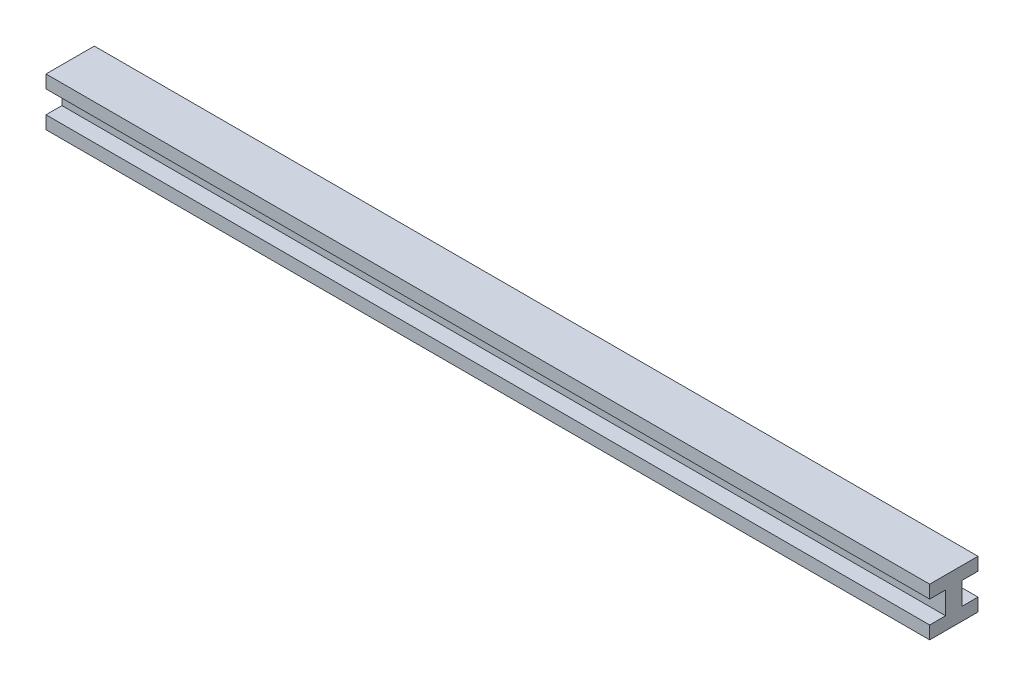
ISO-10303-21;
HEADER;
FILE_DESCRIPTION(('STEP AP214'),'2;1');
FILE_NAME('part.step','',(''),(''),'','','');
FILE_SCHEMA(('AUTOMOTIVE_DESIGN { 1 0 10303 214 1 1 1 1 }'));
ENDSEC;
DATA;
#1=APPLICATION_CONTEXT('core data for automotive mechanical design processes');
#2=APPLICATION_PROTOCOL_DEFINITION('international standard','automotive_design',2000,#1);
#3=PRODUCT_CONTEXT('',#1,'mechanical');
#4=PRODUCT('Part','Part','',(#3));
#5=PRODUCT_RELATED_PRODUCT_CATEGORY('part','',(#4));
#6=PRODUCT_DEFINITION_FORMATION('','',#4);
#7=PRODUCT_DEFINITION_CONTEXT('part definition',#1,'design');
#8=PRODUCT_DEFINITION('design','',#6,#7);
#9=PRODUCT_DEFINITION_SHAPE('','',#8);
#10=(LENGTH_UNIT() NAMED_UNIT(*) SI_UNIT(.MILLI.,.METRE.));
#11=(NAMED_UNIT(*) PLANE_ANGLE_UNIT() SI_UNIT($,.RADIAN.));
#12=(NAMED_UNIT(*) SI_UNIT($,.STERADIAN.) SOLID_ANGLE_UNIT());
#13=UNCERTAINTY_MEASURE_WITH_UNIT(LENGTH_MEASURE(1.E-05),#10,'distance_accuracy_value','');
#14=(GEOMETRIC_REPRESENTATION_CONTEXT(3) GLOBAL_UNCERTAINTY_ASSIGNED_CONTEXT((#13)) GLOBAL_UNIT_ASSIGNED_CONTEXT((#10,
#11,#12)) REPRESENTATION_CONTEXT('',''));
#15=CARTESIAN_POINT('',(0.,0.,0.));
#16=DIRECTION('',(0.,0.,1.));
#17=DIRECTION('',(1.,0.,0.));
#18=AXIS2_PLACEMENT_3D('',#15,#16,#17);
#19=CARTESIAN_POINT('',(1500.,0.,0.));
#20=DIRECTION('',(0.,0.,-1.));
#21=DIRECTION('',(-1.,0.,0.));
#22=AXIS2_PLACEMENT_3D('',#19,#20,#21);
#23=PLANE('',#22);
#24=DIRECTION('',(0.,-1.,0.));
#25=VECTOR('',#24,1.);
#26=CARTESIAN_POINT('',(0.,0.,0.));
#27=LINE('',#26,#25);
#28=CARTESIAN_POINT('',(0.,0.,0.));
#29=VERTEX_POINT('',#28);
#30=CARTESIAN_POINT('',(0.,-22.,0.));
#31=VERTEX_POINT('',#30);
#32=EDGE_CURVE('E157',#29,#31,#27,.T.);
#33=ORIENTED_EDGE('',*,*,#32,.T.);
#34=DIRECTION('',(-1.,0.,0.));
#35=VECTOR('',#34,1.);
#36=CARTESIAN_POINT('',(1500.,-22.,0.));
#37=LINE('',#36,#35);
#38=CARTESIAN_POINT('',(1500.,-22.,0.));
#39=VERTEX_POINT('',#38);
#40=EDGE_CURVE('E11',#39,#31,#37,.T.);
#41=ORIENTED_EDGE('',*,*,#40,.F.);
#42=DIRECTION('',(0.,-1.,0.));
#43=VECTOR('',#42,1.);
#44=CARTESIAN_POINT('',(1500.,0.,0.));
#45=LINE('',#44,#43);
#46=CARTESIAN_POINT('',(1500.,0.,0.));
#47=VERTEX_POINT('',#46);
#48=EDGE_CURVE('E186',#47,#39,#45,.T.);
#49=ORIENTED_EDGE('',*,*,#48,.F.);
#50=DIRECTION('',(-1.,0.,0.));
#51=VECTOR('',#50,1.);
#52=CARTESIAN_POINT('',(1500.,0.,0.));
#53=LINE('',#52,#51);
#54=EDGE_CURVE('E53',#47,#29,#53,.T.);
#55=ORIENTED_EDGE('',*,*,#54,.T.);
#56=EDGE_LOOP('',(#33,#41,#49,#55));
#57=FACE_BOUND('',#56,.T.);
#58=ADVANCED_FACE('F37',(#57),#23,.F.);
#59=CARTESIAN_POINT('',(1500.,-22.,0.));
#60=DIRECTION('',(0.,1.,0.));
#61=DIRECTION('',(0.,0.,1.));
#62=AXIS2_PLACEMENT_3D('',#59,#60,#61);
#63=PLANE('',#62);
#64=DIRECTION('',(0.,0.,-1.));
#65=VECTOR('',#64,1.);
#66=CARTESIAN_POINT('',(0.,-22.,0.));
#67=LINE('',#66,#65);
#68=CARTESIAN_POINT('',(0.,-22.,-27.));
#69=VERTEX_POINT('',#68);
#70=EDGE_CURVE('E159',#31,#69,#67,.T.);
#71=ORIENTED_EDGE('',*,*,#70,.T.);
#72=DIRECTION('',(-1.,0.,0.));
#73=VECTOR('',#72,1.);
#74=CARTESIAN_POINT('',(1500.,-22.,-27.));
#75=LINE('',#74,#73);
#76=CARTESIAN_POINT('',(1500.,-22.,-27.));
#77=VERTEX_POINT('',#76);
#78=EDGE_CURVE('E45',#77,#69,#75,.T.);
#79=ORIENTED_EDGE('',*,*,#78,.F.);
#80=DIRECTION('',(0.,0.,-1.));
#81=VECTOR('',#80,1.);
#82=CARTESIAN_POINT('',(1500.,-22.,0.));
#83=LINE('',#82,#81);
#84=EDGE_CURVE('E103',#39,#77,#83,.T.);
#85=ORIENTED_EDGE('',*,*,#84,.F.);
#86=ORIENTED_EDGE('',*,*,#40,.T.);
#87=EDGE_LOOP('',(#71,#79,#85,#86));
#88=FACE_BOUND('',#87,.T.);
#89=ADVANCED_FACE('F252',(#88),#63,.F.);
#90=CARTESIAN_POINT('',(1500.,-22.,-27.));
#91=DIRECTION('',(0.,0.,-1.));
#92=DIRECTION('',(0.,1.,0.));
#93=AXIS2_PLACEMENT_3D('',#90,#91,#92);
#94=PLANE('',#93);
#95=DIRECTION('',(0.,-1.,0.));
#96=VECTOR('',#95,1.);
#97=CARTESIAN_POINT('',(0.,-22.,-27.));
#98=LINE('',#97,#96);
#99=CARTESIAN_POINT('',(0.,-60.,-27.));
#100=VERTEX_POINT('',#99);
#101=EDGE_CURVE('E161',#69,#100,#98,.T.);
#102=ORIENTED_EDGE('',*,*,#101,.T.);
#103=DIRECTION('',(-1.,0.,0.));
#104=VECTOR('',#103,1.);
#105=CARTESIAN_POINT('',(1500.,-60.,-27.));
#106=LINE('',#105,#104);
#107=CARTESIAN_POINT('',(1500.,-60.,-27.));
#108=VERTEX_POINT('',#107);
#109=EDGE_CURVE('E201',#108,#100,#106,.T.);
#110=ORIENTED_EDGE('',*,*,#109,.F.);
#111=DIRECTION('',(0.,-1.,0.));
#112=VECTOR('',#111,1.);
#113=CARTESIAN_POINT('',(1500.,-22.,-27.));
#114=LINE('',#113,#112);
#115=EDGE_CURVE('E209',#77,#108,#114,.T.);
#116=ORIENTED_EDGE('',*,*,#115,.F.);
#117=ORIENTED_EDGE('',*,*,#78,.T.);
#118=EDGE_LOOP('',(#102,#110,#116,#117));
#119=FACE_BOUND('',#118,.T.);
#120=ADVANCED_FACE('F207',(#119),#94,.F.);
#121=CARTESIAN_POINT('',(1500.,-60.,-27.));
#122=DIRECTION('',(0.,-1.,0.));
#123=DIRECTION('',(0.,0.,-1.));
#124=AXIS2_PLACEMENT_3D('',#121,#122,#123);
#125=PLANE('',#124);
#126=DIRECTION('',(0.,0.,1.));
#127=VECTOR('',#126,1.);
#128=CARTESIAN_POINT('',(0.,-60.,-27.));
#129=LINE('',#128,#127);
#130=CARTESIAN_POINT('',(0.,-60.,0.));
#131=VERTEX_POINT('',#130);
#132=EDGE_CURVE('E163',#100,#131,#129,.T.);
#133=ORIENTED_EDGE('',*,*,#132,.T.);
#134=DIRECTION('',(-1.,0.,0.));
#135=VECTOR('',#134,1.);
#136=CARTESIAN_POINT('',(1500.,-60.,0.));
#137=LINE('',#136,#135);
#138=CARTESIAN_POINT('',(1500.,-60.,0.));
#139=VERTEX_POINT('',#138);
#140=EDGE_CURVE('E198',#139,#131,#137,.T.);
#141=ORIENTED_EDGE('',*,*,#140,.F.);
#142=DIRECTION('',(0.,0.,1.));
#143=VECTOR('',#142,1.);
#144=CARTESIAN_POINT('',(1500.,-60.,-27.));
#145=LINE('',#144,#143);
#146=EDGE_CURVE('E226',#108,#139,#145,.T.);
#147=ORIENTED_EDGE('',*,*,#146,.F.);
#148=ORIENTED_EDGE('',*,*,#109,.T.);
#149=EDGE_LOOP('',(#133,#141,#147,#148));
#150=FACE_BOUND('',#149,.T.);
#151=ADVANCED_FACE('F216',(#150),#125,.F.);
#152=CARTESIAN_POINT('',(1500.,-60.,0.));
#153=DIRECTION('',(0.,0.,-1.));
#154=DIRECTION('',(0.,1.,0.));
#155=AXIS2_PLACEMENT_3D('',#152,#153,#154);
#156=PLANE('',#155);
#157=DIRECTION('',(0.,-1.,0.));
#158=VECTOR('',#157,1.);
#159=CARTESIAN_POINT('',(0.,-60.,0.));
#160=LINE('',#159,#158);
#161=CARTESIAN_POINT('',(0.,-82.,0.));
#162=VERTEX_POINT('',#161);
#163=EDGE_CURVE('E165',#131,#162,#160,.T.);
#164=ORIENTED_EDGE('',*,*,#163,.T.);
#165=DIRECTION('',(-1.,0.,0.));
#166=VECTOR('',#165,1.);
#167=CARTESIAN_POINT('',(1500.,-82.,0.));
#168=LINE('',#167,#166);
#169=CARTESIAN_POINT('',(1500.,-82.,0.));
#170=VERTEX_POINT('',#169);
#171=EDGE_CURVE('E196',#170,#162,#168,.T.);
#172=ORIENTED_EDGE('',*,*,#171,.F.);
#173=DIRECTION('',(0.,-1.,0.));
#174=VECTOR('',#173,1.);
#175=CARTESIAN_POINT('',(1500.,-60.,0.));
#176=LINE('',#175,#174);
#177=EDGE_CURVE('E222',#139,#170,#176,.T.);
#178=ORIENTED_EDGE('',*,*,#177,.F.);
#179=ORIENTED_EDGE('',*,*,#140,.T.);
#180=EDGE_LOOP('',(#164,#172,#178,#179));
#181=FACE_BOUND('',#180,.T.);
#182=ADVANCED_FACE('F220',(#181),#156,.F.);
#183=CARTESIAN_POINT('',(1500.,-82.,-82.));
#184=DIRECTION('',(0.,-1.,0.));
#185=DIRECTION('',(0.,0.,-1.));
#186=AXIS2_PLACEMENT_3D('',#183,#184,#185);
#187=PLANE('',#186);
#188=DIRECTION('',(0.,0.,1.));
#189=VECTOR('',#188,1.);
#190=CARTESIAN_POINT('',(0.,-82.,-82.));
#191=LINE('',#190,#189);
#192=CARTESIAN_POINT('',(0.,-82.,-82.));
#193=VERTEX_POINT('',#192);
#194=EDGE_CURVE('E168',#193,#162,#191,.T.);
#195=ORIENTED_EDGE('',*,*,#194,.F.);
#196=DIRECTION('',(-1.,0.,0.));
#197=VECTOR('',#196,1.);
#198=CARTESIAN_POINT('',(1500.,-82.,-82.));
#199=LINE('',#198,#197);
#200=CARTESIAN_POINT('',(1500.,-82.,-82.));
#201=VERTEX_POINT('',#200);
#202=EDGE_CURVE('E194',#201,#193,#199,.T.);
#203=ORIENTED_EDGE('',*,*,#202,.F.);
#204=DIRECTION('',(0.,0.,1.));
#205=VECTOR('',#204,1.);
#206=CARTESIAN_POINT('',(1500.,-82.,-82.));
#207=LINE('',#206,#205);
#208=EDGE_CURVE('E225',#201,#170,#207,.T.);
#209=ORIENTED_EDGE('',*,*,#208,.T.);
#210=ORIENTED_EDGE('',*,*,#171,.T.);
#211=EDGE_LOOP('',(#195,#203,#209,#210));
#212=FACE_BOUND('',#211,.T.);
#213=ADVANCED_FACE('F268',(#212),#187,.T.);
#214=CARTESIAN_POINT('',(1500.,-60.,-82.));
#215=DIRECTION('',(0.,0.,-1.));
#216=DIRECTION('',(-1.,0.,0.));
#217=AXIS2_PLACEMENT_3D('',#214,#215,#216);
#218=PLANE('',#217);
#219=DIRECTION('',(0.,-1.,0.));
#220=VECTOR('',#219,1.);
#221=CARTESIAN_POINT('',(0.,-60.,-82.));
#222=LINE('',#221,#220);
#223=CARTESIAN_POINT('',(0.,-60.,-82.));
#224=VERTEX_POINT('',#223);
#225=EDGE_CURVE('E171',#224,#193,#222,.T.);
#226=ORIENTED_EDGE('',*,*,#225,.F.);
#227=DIRECTION('',(-1.,0.,0.));
#228=VECTOR('',#227,1.);
#229=CARTESIAN_POINT('',(1500.,-60.,-82.));
#230=LINE('',#229,#228);
#231=CARTESIAN_POINT('',(1500.,-60.,-82.));
#232=VERTEX_POINT('',#231);
#233=EDGE_CURVE('E192',#232,#224,#230,.T.);
#234=ORIENTED_EDGE('',*,*,#233,.F.);
#235=DIRECTION('',(0.,-1.,0.));
#236=VECTOR('',#235,1.);
#237=CARTESIAN_POINT('',(1500.,-60.,-82.));
#238=LINE('',#237,#236);
#239=EDGE_CURVE('E228',#232,#201,#238,.T.);
#240=ORIENTED_EDGE('',*,*,#239,.T.);
#241=ORIENTED_EDGE('',*,*,#202,.T.);
#242=EDGE_LOOP('',(#226,#234,#240,#241));
#243=FACE_BOUND('',#242,.T.);
#244=ADVANCED_FACE('F271',(#243),#218,.T.);
#245=CARTESIAN_POINT('',(1500.,-60.,-82.));
#246=DIRECTION('',(0.,-1.,0.));
#247=DIRECTION('',(0.,0.,-1.));
#248=AXIS2_PLACEMENT_3D('',#245,#246,#247);
#249=PLANE('',#248);
#250=DIRECTION('',(0.,0.,1.));
#251=VECTOR('',#250,1.);
#252=CARTESIAN_POINT('',(0.,-60.,-82.));
#253=LINE('',#252,#251);
#254=CARTESIAN_POINT('',(0.,-60.,-55.));
#255=VERTEX_POINT('',#254);
#256=EDGE_CURVE('E174',#224,#255,#253,.T.);
#257=ORIENTED_EDGE('',*,*,#256,.T.);
#258=DIRECTION('',(-1.,0.,0.));
#259=VECTOR('',#258,1.);
#260=CARTESIAN_POINT('',(1500.,-60.,-55.));
#261=LINE('',#260,#259);
#262=CARTESIAN_POINT('',(1500.,-60.,-55.));
#263=VERTEX_POINT('',#262);
#264=EDGE_CURVE('E190',#263,#255,#261,.T.);
#265=ORIENTED_EDGE('',*,*,#264,.F.);
#266=DIRECTION('',(0.,0.,1.));
#267=VECTOR('',#266,1.);
#268=CARTESIAN_POINT('',(1500.,-60.,-82.));
#269=LINE('',#268,#267);
#270=EDGE_CURVE('E235',#232,#263,#269,.T.);
#271=ORIENTED_EDGE('',*,*,#270,.F.);
#272=ORIENTED_EDGE('',*,*,#233,.T.);
#273=EDGE_LOOP('',(#257,#265,#271,#272));
#274=FACE_BOUND('',#273,.T.);
#275=ADVANCED_FACE('F275',(#274),#249,.F.);
#276=CARTESIAN_POINT('',(1500.,-22.,-55.));
#277=DIRECTION('',(0.,0.,-1.));
#278=DIRECTION('',(-1.,0.,0.));
#279=AXIS2_PLACEMENT_3D('',#276,#277,#278);
#280=PLANE('',#279);
#281=DIRECTION('',(0.,-1.,0.));
#282=VECTOR('',#281,1.);
#283=CARTESIAN_POINT('',(0.,-22.,-55.));
#284=LINE('',#283,#282);
#285=CARTESIAN_POINT('',(0.,-22.,-55.));
#286=VERTEX_POINT('',#285);
#287=EDGE_CURVE('E177',#286,#255,#284,.T.);
#288=ORIENTED_EDGE('',*,*,#287,.F.);
#289=DIRECTION('',(-1.,0.,0.));
#290=VECTOR('',#289,1.);
#291=CARTESIAN_POINT('',(1500.,-22.,-55.));
#292=LINE('',#291,#290);
#293=CARTESIAN_POINT('',(1500.,-22.,-55.));
#294=VERTEX_POINT('',#293);
#295=EDGE_CURVE('E149',#294,#286,#292,.T.);
#296=ORIENTED_EDGE('',*,*,#295,.F.);
#297=DIRECTION('',(0.,-1.,0.));
#298=VECTOR('',#297,1.);
#299=CARTESIAN_POINT('',(1500.,-22.,-55.));
#300=LINE('',#299,#298);
#301=EDGE_CURVE('E139',#294,#263,#300,.T.);
#302=ORIENTED_EDGE('',*,*,#301,.T.);
#303=ORIENTED_EDGE('',*,*,#264,.T.);
#304=EDGE_LOOP('',(#288,#296,#302,#303));
#305=FACE_BOUND('',#304,.T.);
#306=ADVANCED_FACE('F238',(#305),#280,.T.);
#307=CARTESIAN_POINT('',(1500.,-22.,-55.));
#308=DIRECTION('',(0.,1.,0.));
#309=DIRECTION('',(0.,0.,1.));
#310=AXIS2_PLACEMENT_3D('',#307,#308,#309);
#311=PLANE('',#310);
#312=DIRECTION('',(0.,0.,-1.));
#313=VECTOR('',#312,1.);
#314=CARTESIAN_POINT('',(0.,-22.,-55.));
#315=LINE('',#314,#313);
#316=CARTESIAN_POINT('',(0.,-22.,-82.));
#317=VERTEX_POINT('',#316);
#318=EDGE_CURVE('E146',#286,#317,#315,.T.);
#319=ORIENTED_EDGE('',*,*,#318,.T.);
#320=DIRECTION('',(-1.,0.,0.));
#321=VECTOR('',#320,1.);
#322=CARTESIAN_POINT('',(1500.,-22.,-82.));
#323=LINE('',#322,#321);
#324=CARTESIAN_POINT('',(1500.,-22.,-82.));
#325=VERTEX_POINT('',#324);
#326=EDGE_CURVE('E143',#325,#317,#323,.T.);
#327=ORIENTED_EDGE('',*,*,#326,.F.);
#328=DIRECTION('',(0.,0.,-1.));
#329=VECTOR('',#328,1.);
#330=CARTESIAN_POINT('',(1500.,-22.,-55.));
#331=LINE('',#330,#329);
#332=EDGE_CURVE('E132',#294,#325,#331,.T.);
#333=ORIENTED_EDGE('',*,*,#332,.F.);
#334=ORIENTED_EDGE('',*,*,#295,.T.);
#335=EDGE_LOOP('',(#319,#327,#333,#334));
#336=FACE_BOUND('',#335,.T.);
#337=ADVANCED_FACE('F144',(#336),#311,.F.);
#338=CARTESIAN_POINT('',(1500.,0.,-82.));
#339=DIRECTION('',(0.,0.,-1.));
#340=DIRECTION('',(-1.,0.,0.));
#341=AXIS2_PLACEMENT_3D('',#338,#339,#340);
#342=PLANE('',#341);
#343=DIRECTION('',(0.,-1.,0.));
#344=VECTOR('',#343,1.);
#345=CARTESIAN_POINT('',(0.,0.,-82.));
#346=LINE('',#345,#344);
#347=CARTESIAN_POINT('',(0.,0.,-82.));
#348=VERTEX_POINT('',#347);
#349=EDGE_CURVE('E181',#348,#317,#346,.T.);
#350=ORIENTED_EDGE('',*,*,#349,.F.);
#351=DIRECTION('',(-1.,0.,0.));
#352=VECTOR('',#351,1.);
#353=CARTESIAN_POINT('',(1500.,0.,-82.));
#354=LINE('',#353,#352);
#355=CARTESIAN_POINT('',(1500.,0.,-82.));
#356=VERTEX_POINT('',#355);
#357=EDGE_CURVE('E91',#356,#348,#354,.T.);
#358=ORIENTED_EDGE('',*,*,#357,.F.);
#359=DIRECTION('',(0.,-1.,0.));
#360=VECTOR('',#359,1.);
#361=CARTESIAN_POINT('',(1500.,0.,-82.));
#362=LINE('',#361,#360);
#363=EDGE_CURVE('E137',#356,#325,#362,.T.);
#364=ORIENTED_EDGE('',*,*,#363,.T.);
#365=ORIENTED_EDGE('',*,*,#326,.T.);
#366=EDGE_LOOP('',(#350,#358,#364,#365));
#367=FACE_BOUND('',#366,.T.);
#368=ADVANCED_FACE('F151',(#367),#342,.T.);
#369=CARTESIAN_POINT('',(1500.,0.,0.));
#370=DIRECTION('',(0.,1.,0.));
#371=DIRECTION('',(0.,0.,1.));
#372=AXIS2_PLACEMENT_3D('',#369,#370,#371);
#373=PLANE('',#372);
#374=DIRECTION('',(0.,0.,-1.));
#375=VECTOR('',#374,1.);
#376=CARTESIAN_POINT('',(0.,0.,0.));
#377=LINE('',#376,#375);
#378=EDGE_CURVE('E183',#29,#348,#377,.T.);
#379=ORIENTED_EDGE('',*,*,#378,.F.);
#380=ORIENTED_EDGE('',*,*,#54,.F.);
#381=DIRECTION('',(0.,0.,-1.));
#382=VECTOR('',#381,1.);
#383=CARTESIAN_POINT('',(1500.,0.,0.));
#384=LINE('',#383,#382);
#385=EDGE_CURVE('E152',#47,#356,#384,.T.);
#386=ORIENTED_EDGE('',*,*,#385,.T.);
#387=ORIENTED_EDGE('',*,*,#357,.T.);
#388=EDGE_LOOP('',(#379,#380,#386,#387));
#389=FACE_BOUND('',#388,.T.);
#390=ADVANCED_FACE('F241',(#389),#373,.T.);
#391=CARTESIAN_POINT('',(1500.,0.,0.));
#392=DIRECTION('',(1.,0.,0.));
#393=DIRECTION('',(0.,0.,-1.));
#394=AXIS2_PLACEMENT_3D('',#391,#392,#393);
#395=PLANE('',#394);
#396=ORIENTED_EDGE('',*,*,#48,.T.);
#397=ORIENTED_EDGE('',*,*,#84,.T.);
#398=ORIENTED_EDGE('',*,*,#115,.T.);
#399=ORIENTED_EDGE('',*,*,#146,.T.);
#400=ORIENTED_EDGE('',*,*,#177,.T.);
#401=ORIENTED_EDGE('',*,*,#208,.F.);
#402=ORIENTED_EDGE('',*,*,#239,.F.);
#403=ORIENTED_EDGE('',*,*,#270,.T.);
#404=ORIENTED_EDGE('',*,*,#301,.F.);
#405=ORIENTED_EDGE('',*,*,#332,.T.);
#406=ORIENTED_EDGE('',*,*,#363,.F.);
#407=ORIENTED_EDGE('',*,*,#385,.F.);
#408=EDGE_LOOP('',(#396,#397,#398,#399,#400,#401,#402,#403,#404,#405,#406,#407));
#409=FACE_BOUND('',#408,.T.);
#410=ADVANCED_FACE('F134',(#409),#395,.T.);
#411=CARTESIAN_POINT('',(0.,0.,0.));
#412=DIRECTION('',(1.,0.,0.));
#413=DIRECTION('',(0.,0.,-1.));
#414=AXIS2_PLACEMENT_3D('',#411,#412,#413);
#415=PLANE('',#414);
#416=ORIENTED_EDGE('',*,*,#32,.F.);
#417=ORIENTED_EDGE('',*,*,#378,.T.);
#418=ORIENTED_EDGE('',*,*,#349,.T.);
#419=ORIENTED_EDGE('',*,*,#318,.F.);
#420=ORIENTED_EDGE('',*,*,#287,.T.);
#421=ORIENTED_EDGE('',*,*,#256,.F.);
#422=ORIENTED_EDGE('',*,*,#225,.T.);
#423=ORIENTED_EDGE('',*,*,#194,.T.);
#424=ORIENTED_EDGE('',*,*,#163,.F.);
#425=ORIENTED_EDGE('',*,*,#132,.F.);
#426=ORIENTED_EDGE('',*,*,#101,.F.);
#427=ORIENTED_EDGE('',*,*,#70,.F.);
#428=EDGE_LOOP('',(#416,#417,#418,#419,#420,#421,#422,#423,#424,#425,#426,#427));
#429=FACE_BOUND('',#428,.T.);
#430=ADVANCED_FACE('F212',(#429),#415,.F.);
#431=CLOSED_SHELL('',(#58,#89,#120,#151,#182,#213,#244,#275,#306,#337,#368,#390,#410,#430));
#432=MANIFOLD_SOLID_BREP('B2',#431);
#433=ADVANCED_BREP_SHAPE_REPRESENTATION('',(#18,#432),#14);
#434=SHAPE_DEFINITION_REPRESENTATION(#9,#433);
ENDSEC;
END-ISO-10303-21;
